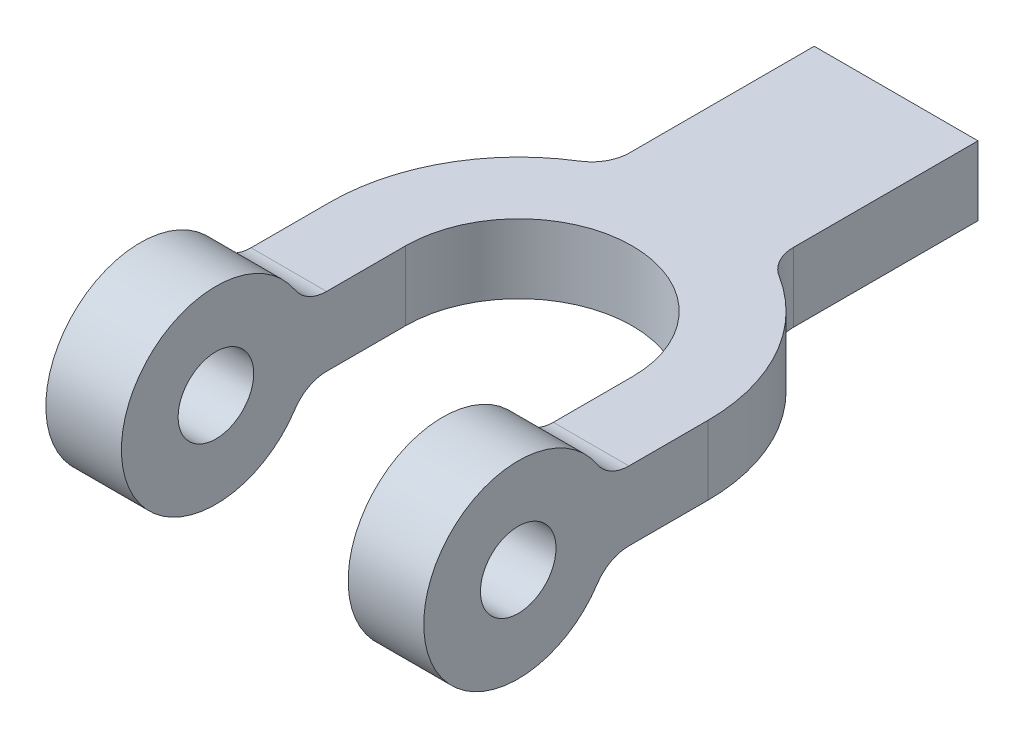
ISO-10303-21;
HEADER;
FILE_DESCRIPTION(('STEP AP214'),'2;1');
FILE_NAME('part.step','',(''),(''),'','','');
FILE_SCHEMA(('AUTOMOTIVE_DESIGN { 1 0 10303 214 1 1 1 1 }'));
ENDSEC;
DATA;
#1=APPLICATION_CONTEXT('core data for automotive mechanical design processes');
#2=APPLICATION_PROTOCOL_DEFINITION('international standard','automotive_design',2000,#1);
#3=PRODUCT_CONTEXT('',#1,'mechanical');
#4=PRODUCT('Part','Part','',(#3));
#5=PRODUCT_RELATED_PRODUCT_CATEGORY('part','',(#4));
#6=PRODUCT_DEFINITION_FORMATION('','',#4);
#7=PRODUCT_DEFINITION_CONTEXT('part definition',#1,'design');
#8=PRODUCT_DEFINITION('design','',#6,#7);
#9=PRODUCT_DEFINITION_SHAPE('','',#8);
#10=(LENGTH_UNIT() NAMED_UNIT(*) SI_UNIT(.MILLI.,.METRE.));
#11=(NAMED_UNIT(*) PLANE_ANGLE_UNIT() SI_UNIT($,.RADIAN.));
#12=(NAMED_UNIT(*) SI_UNIT($,.STERADIAN.) SOLID_ANGLE_UNIT());
#13=UNCERTAINTY_MEASURE_WITH_UNIT(LENGTH_MEASURE(1.E-05),#10,'distance_accuracy_value','');
#14=(GEOMETRIC_REPRESENTATION_CONTEXT(3) GLOBAL_UNCERTAINTY_ASSIGNED_CONTEXT((#13)) GLOBAL_UNIT_ASSIGNED_CONTEXT((#10,
#11,#12)) REPRESENTATION_CONTEXT('',''));
#15=CARTESIAN_POINT('',(0.,0.,0.));
#16=DIRECTION('',(0.,0.,1.));
#17=DIRECTION('',(1.,0.,0.));
#18=AXIS2_PLACEMENT_3D('',#15,#16,#17);
#19=CARTESIAN_POINT('',(-35.,67.5,72.2374584276855));
#20=DIRECTION('',(1.,0.,0.));
#21=DIRECTION('',(0.,0.,-1.));
#22=AXIS2_PLACEMENT_3D('',#19,#20,#21);
#23=PLANE('',#22);
#24=CARTESIAN_POINT('',(-35.,50.,54.7374584276855));
#25=DIRECTION('',(1.,0.,0.));
#26=DIRECTION('',(0.,0.,-1.));
#27=AXIS2_PLACEMENT_3D('',#24,#25,#26);
#28=CIRCLE('',#27,7.);
#29=CARTESIAN_POINT('',(-35.,50.,47.7374584276855));
#30=VERTEX_POINT('',#29);
#31=EDGE_CURVE('E372',#30,#30,#28,.T.);
#32=ORIENTED_EDGE('',*,*,#31,.T.);
#33=EDGE_LOOP('',(#32));
#34=FACE_BOUND('',#33,.T.);
#35=DIRECTION('',(0.,0.,-1.));
#36=VECTOR('',#35,1.);
#37=CARTESIAN_POINT('',(-35.,43.5881606588632,10.9874584276855));
#38=LINE('',#37,#36);
#39=CARTESIAN_POINT('',(-35.,43.5881606588632,34.2344692434827));
#40=VERTEX_POINT('',#39);
#41=CARTESIAN_POINT('',(-35.,43.5881606588632,19.6129708342571));
#42=VERTEX_POINT('',#41);
#43=EDGE_CURVE('E277',#40,#42,#38,.T.);
#44=ORIENTED_EDGE('',*,*,#43,.F.);
#45=CARTESIAN_POINT('',(-35.,36.5881606588632,34.2344692434827));
#46=DIRECTION('',(1.,0.,0.));
#47=DIRECTION('',(0.,0.,-1.));
#48=AXIS2_PLACEMENT_3D('',#45,#46,#47);
#49=CIRCLE('',#48,7.);
#50=CARTESIAN_POINT('',(-35.,40.4201147563309,40.0924661532549));
#51=VERTEX_POINT('',#50);
#52=EDGE_CURVE('E287',#40,#51,#49,.T.);
#53=ORIENTED_EDGE('',*,*,#52,.T.);
#54=CARTESIAN_POINT('',(-35.,50.,54.7374584276855));
#55=DIRECTION('',(1.,0.,0.));
#56=DIRECTION('',(0.,0.,-1.));
#57=AXIS2_PLACEMENT_3D('',#54,#55,#56);
#58=CIRCLE('',#57,17.5);
#59=CARTESIAN_POINT('',(-35.,59.5798852436691,40.0924661532549));
#60=VERTEX_POINT('',#59);
#61=EDGE_CURVE('E382',#60,#51,#58,.T.);
#62=ORIENTED_EDGE('',*,*,#61,.F.);
#63=CARTESIAN_POINT('',(-35.,63.4118393411367,34.2344692434827));
#64=DIRECTION('',(1.,0.,0.));
#65=DIRECTION('',(0.,0.,-1.));
#66=AXIS2_PLACEMENT_3D('',#63,#64,#65);
#67=CIRCLE('',#66,7.);
#68=CARTESIAN_POINT('',(-35.,56.4118393411367,34.2344692434827));
#69=VERTEX_POINT('',#68);
#70=EDGE_CURVE('E310',#69,#60,#67,.F.);
#71=ORIENTED_EDGE('',*,*,#70,.F.);
#72=DIRECTION('',(0.,0.,-1.));
#73=VECTOR('',#72,1.);
#74=CARTESIAN_POINT('',(-35.,56.4118393411367,10.9874584276855));
#75=LINE('',#74,#73);
#76=CARTESIAN_POINT('',(-35.,56.4118393411367,19.6129708342571));
#77=VERTEX_POINT('',#76);
#78=EDGE_CURVE('E313',#69,#77,#75,.T.);
#79=ORIENTED_EDGE('',*,*,#78,.T.);
#80=DIRECTION('',(0.,1.,0.));
#81=VECTOR('',#80,1.);
#82=CARTESIAN_POINT('',(-35.,32.5,19.6129708342571));
#83=LINE('',#82,#81);
#84=EDGE_CURVE('E296',#42,#77,#83,.T.);
#85=ORIENTED_EDGE('',*,*,#84,.F.);
#86=EDGE_LOOP('',(#44,#53,#62,#71,#79,#85));
#87=FACE_BOUND('',#86,.T.);
#88=ADVANCED_FACE('F149',(#34,#87),#23,.F.);
#89=CARTESIAN_POINT('',(35.,67.5,72.2374584276855));
#90=DIRECTION('',(-1.,0.,0.));
#91=DIRECTION('',(0.,0.,1.));
#92=AXIS2_PLACEMENT_3D('',#89,#90,#91);
#93=PLANE('',#92);
#94=CARTESIAN_POINT('',(35.,50.,54.7374584276855));
#95=DIRECTION('',(1.,0.,0.));
#96=DIRECTION('',(0.,0.,-1.));
#97=AXIS2_PLACEMENT_3D('',#94,#95,#96);
#98=CIRCLE('',#97,7.);
#99=CARTESIAN_POINT('',(35.,50.,47.7374584276855));
#100=VERTEX_POINT('',#99);
#101=EDGE_CURVE('E371',#100,#100,#98,.T.);
#102=ORIENTED_EDGE('',*,*,#101,.F.);
#103=EDGE_LOOP('',(#102));
#104=FACE_BOUND('',#103,.T.);
#105=DIRECTION('',(0.,0.,-1.));
#106=VECTOR('',#105,1.);
#107=CARTESIAN_POINT('',(35.,43.5881606588632,10.9874584276855));
#108=LINE('',#107,#106);
#109=CARTESIAN_POINT('',(35.,43.5881606588632,34.2344692434827));
#110=VERTEX_POINT('',#109);
#111=CARTESIAN_POINT('',(35.,43.5881606588632,19.6129708342571));
#112=VERTEX_POINT('',#111);
#113=EDGE_CURVE('E300',#110,#112,#108,.T.);
#114=ORIENTED_EDGE('',*,*,#113,.T.);
#115=DIRECTION('',(0.,1.,0.));
#116=VECTOR('',#115,1.);
#117=CARTESIAN_POINT('',(35.,32.5,19.6129708342571));
#118=LINE('',#117,#116);
#119=CARTESIAN_POINT('',(35.,56.4118393411367,19.6129708342571));
#120=VERTEX_POINT('',#119);
#121=EDGE_CURVE('E390',#112,#120,#118,.T.);
#122=ORIENTED_EDGE('',*,*,#121,.T.);
#123=DIRECTION('',(0.,0.,-1.));
#124=VECTOR('',#123,1.);
#125=CARTESIAN_POINT('',(35.,56.4118393411367,10.9874584276855));
#126=LINE('',#125,#124);
#127=CARTESIAN_POINT('',(35.,56.4118393411367,34.2344692434827));
#128=VERTEX_POINT('',#127);
#129=EDGE_CURVE('E314',#128,#120,#126,.T.);
#130=ORIENTED_EDGE('',*,*,#129,.F.);
#131=CARTESIAN_POINT('',(35.,63.4118393411367,34.2344692434827));
#132=DIRECTION('',(1.,0.,0.));
#133=DIRECTION('',(0.,0.,-1.));
#134=AXIS2_PLACEMENT_3D('',#131,#132,#133);
#135=CIRCLE('',#134,7.);
#136=CARTESIAN_POINT('',(35.,59.5798852436691,40.0924661532549));
#137=VERTEX_POINT('',#136);
#138=EDGE_CURVE('E317',#128,#137,#135,.F.);
#139=ORIENTED_EDGE('',*,*,#138,.T.);
#140=CARTESIAN_POINT('',(35.,50.,54.7374584276855));
#141=DIRECTION('',(1.,0.,0.));
#142=DIRECTION('',(0.,0.,-1.));
#143=AXIS2_PLACEMENT_3D('',#140,#141,#142);
#144=CIRCLE('',#143,17.5);
#145=CARTESIAN_POINT('',(35.,40.4201147563309,40.0924661532549));
#146=VERTEX_POINT('',#145);
#147=EDGE_CURVE('E381',#137,#146,#144,.T.);
#148=ORIENTED_EDGE('',*,*,#147,.T.);
#149=CARTESIAN_POINT('',(35.,36.5881606588632,34.2344692434827));
#150=DIRECTION('',(1.,0.,0.));
#151=DIRECTION('',(0.,0.,-1.));
#152=AXIS2_PLACEMENT_3D('',#149,#150,#151);
#153=CIRCLE('',#152,7.);
#154=EDGE_CURVE('E297',#110,#146,#153,.T.);
#155=ORIENTED_EDGE('',*,*,#154,.F.);
#156=EDGE_LOOP('',(#114,#122,#130,#139,#148,#155));
#157=FACE_BOUND('',#156,.T.);
#158=ADVANCED_FACE('F436',(#104,#157),#93,.F.);
#159=CARTESIAN_POINT('',(-21.,32.5,10.9874584276855));
#160=DIRECTION('',(-1.,0.,0.));
#161=DIRECTION('',(0.,0.,1.));
#162=AXIS2_PLACEMENT_3D('',#159,#160,#161);
#163=PLANE('',#162);
#164=CARTESIAN_POINT('',(-21.,50.,54.7374584276855));
#165=DIRECTION('',(-1.,0.,0.));
#166=DIRECTION('',(0.,0.,1.));
#167=AXIS2_PLACEMENT_3D('',#164,#165,#166);
#168=CIRCLE('',#167,7.);
#169=CARTESIAN_POINT('',(-21.,50.,61.7374584276855));
#170=VERTEX_POINT('',#169);
#171=EDGE_CURVE('E378',#170,#170,#168,.T.);
#172=ORIENTED_EDGE('',*,*,#171,.T.);
#173=EDGE_LOOP('',(#172));
#174=FACE_BOUND('',#173,.T.);
#175=DIRECTION('',(0.,0.,1.));
#176=VECTOR('',#175,1.);
#177=CARTESIAN_POINT('',(-21.,43.5881606588632,10.9874584276855));
#178=LINE('',#177,#176);
#179=CARTESIAN_POINT('',(-21.,43.5881606588632,19.6129708342571));
#180=VERTEX_POINT('',#179);
#181=CARTESIAN_POINT('',(-21.,43.5881606588632,34.2344692434827));
#182=VERTEX_POINT('',#181);
#183=EDGE_CURVE('E280',#180,#182,#178,.T.);
#184=ORIENTED_EDGE('',*,*,#183,.F.);
#185=DIRECTION('',(0.,1.,0.));
#186=VECTOR('',#185,1.);
#187=CARTESIAN_POINT('',(-21.,32.5,19.6129708342571));
#188=LINE('',#187,#186);
#189=CARTESIAN_POINT('',(-21.,56.4118393411367,19.6129708342571));
#190=VERTEX_POINT('',#189);
#191=EDGE_CURVE('E387',#180,#190,#188,.T.);
#192=ORIENTED_EDGE('',*,*,#191,.T.);
#193=DIRECTION('',(0.,0.,1.));
#194=VECTOR('',#193,1.);
#195=CARTESIAN_POINT('',(-21.,56.4118393411367,10.9874584276855));
#196=LINE('',#195,#194);
#197=CARTESIAN_POINT('',(-21.,56.4118393411367,34.2344692434827));
#198=VERTEX_POINT('',#197);
#199=EDGE_CURVE('E339',#190,#198,#196,.T.);
#200=ORIENTED_EDGE('',*,*,#199,.T.);
#201=CARTESIAN_POINT('',(-21.,63.4118393411367,34.2344692434827));
#202=DIRECTION('',(-1.,0.,0.));
#203=DIRECTION('',(0.,0.,1.));
#204=AXIS2_PLACEMENT_3D('',#201,#202,#203);
#205=CIRCLE('',#204,7.);
#206=CARTESIAN_POINT('',(-21.,59.5798852436691,40.0924661532549));
#207=VERTEX_POINT('',#206);
#208=EDGE_CURVE('E367',#207,#198,#205,.F.);
#209=ORIENTED_EDGE('',*,*,#208,.F.);
#210=CARTESIAN_POINT('',(-21.,50.,54.7374584276855));
#211=DIRECTION('',(-1.,0.,0.));
#212=DIRECTION('',(0.,0.,1.));
#213=AXIS2_PLACEMENT_3D('',#210,#211,#212);
#214=CIRCLE('',#213,17.5);
#215=CARTESIAN_POINT('',(-21.,40.4201147563309,40.0924661532549));
#216=VERTEX_POINT('',#215);
#217=EDGE_CURVE('E171',#216,#207,#214,.T.);
#218=ORIENTED_EDGE('',*,*,#217,.F.);
#219=CARTESIAN_POINT('',(-21.,36.5881606588632,34.2344692434827));
#220=DIRECTION('',(-1.,0.,0.));
#221=DIRECTION('',(0.,0.,1.));
#222=AXIS2_PLACEMENT_3D('',#219,#220,#221);
#223=CIRCLE('',#222,7.);
#224=EDGE_CURVE('E369',#216,#182,#223,.T.);
#225=ORIENTED_EDGE('',*,*,#224,.T.);
#226=EDGE_LOOP('',(#184,#192,#200,#209,#218,#225));
#227=FACE_BOUND('',#226,.T.);
#228=ADVANCED_FACE('F476',(#174,#227),#163,.F.);
#229=CARTESIAN_POINT('',(21.,32.5,10.9874584276855));
#230=DIRECTION('',(-1.,0.,0.));
#231=DIRECTION('',(0.,0.,1.));
#232=AXIS2_PLACEMENT_3D('',#229,#230,#231);
#233=PLANE('',#232);
#234=CARTESIAN_POINT('',(21.,50.,54.7374584276855));
#235=DIRECTION('',(-1.,0.,0.));
#236=DIRECTION('',(0.,0.,1.));
#237=AXIS2_PLACEMENT_3D('',#234,#235,#236);
#238=CIRCLE('',#237,7.);
#239=CARTESIAN_POINT('',(21.,50.,61.7374584276855));
#240=VERTEX_POINT('',#239);
#241=EDGE_CURVE('E375',#240,#240,#238,.T.);
#242=ORIENTED_EDGE('',*,*,#241,.F.);
#243=EDGE_LOOP('',(#242));
#244=FACE_BOUND('',#243,.T.);
#245=DIRECTION('',(0.,1.,0.));
#246=VECTOR('',#245,1.);
#247=CARTESIAN_POINT('',(21.,32.5,19.6129708342571));
#248=LINE('',#247,#246);
#249=CARTESIAN_POINT('',(21.,43.5881606588632,19.6129708342571));
#250=VERTEX_POINT('',#249);
#251=CARTESIAN_POINT('',(21.,56.4118393411367,19.6129708342571));
#252=VERTEX_POINT('',#251);
#253=EDGE_CURVE('E386',#250,#252,#248,.T.);
#254=ORIENTED_EDGE('',*,*,#253,.F.);
#255=DIRECTION('',(0.,0.,1.));
#256=VECTOR('',#255,1.);
#257=CARTESIAN_POINT('',(21.,43.5881606588632,10.9874584276855));
#258=LINE('',#257,#256);
#259=CARTESIAN_POINT('',(21.,43.5881606588632,34.2344692434827));
#260=VERTEX_POINT('',#259);
#261=EDGE_CURVE('E356',#250,#260,#258,.T.);
#262=ORIENTED_EDGE('',*,*,#261,.T.);
#263=CARTESIAN_POINT('',(21.,36.5881606588632,34.2344692434827));
#264=DIRECTION('',(-1.,0.,0.));
#265=DIRECTION('',(0.,0.,1.));
#266=AXIS2_PLACEMENT_3D('',#263,#264,#265);
#267=CIRCLE('',#266,7.);
#268=CARTESIAN_POINT('',(21.,40.4201147563309,40.0924661532549));
#269=VERTEX_POINT('',#268);
#270=EDGE_CURVE('E12',#269,#260,#267,.T.);
#271=ORIENTED_EDGE('',*,*,#270,.F.);
#272=CARTESIAN_POINT('',(21.,50.,54.7374584276855));
#273=DIRECTION('',(-1.,0.,0.));
#274=DIRECTION('',(0.,0.,1.));
#275=AXIS2_PLACEMENT_3D('',#272,#273,#274);
#276=CIRCLE('',#275,17.5);
#277=CARTESIAN_POINT('',(21.,59.5798852436691,40.0924661532549));
#278=VERTEX_POINT('',#277);
#279=EDGE_CURVE('E163',#269,#278,#276,.T.);
#280=ORIENTED_EDGE('',*,*,#279,.T.);
#281=CARTESIAN_POINT('',(21.,63.4118393411367,34.2344692434827));
#282=DIRECTION('',(-1.,0.,0.));
#283=DIRECTION('',(0.,0.,1.));
#284=AXIS2_PLACEMENT_3D('',#281,#282,#283);
#285=CIRCLE('',#284,7.);
#286=CARTESIAN_POINT('',(21.,56.4118393411367,34.2344692434827));
#287=VERTEX_POINT('',#286);
#288=EDGE_CURVE('E156',#278,#287,#285,.F.);
#289=ORIENTED_EDGE('',*,*,#288,.T.);
#290=DIRECTION('',(0.,0.,1.));
#291=VECTOR('',#290,1.);
#292=CARTESIAN_POINT('',(21.,56.4118393411367,10.9874584276855));
#293=LINE('',#292,#291);
#294=EDGE_CURVE('E337',#252,#287,#293,.T.);
#295=ORIENTED_EDGE('',*,*,#294,.F.);
#296=EDGE_LOOP('',(#254,#262,#271,#280,#289,#295));
#297=FACE_BOUND('',#296,.T.);
#298=ADVANCED_FACE('F426',(#244,#297),#233,.T.);
#299=CARTESIAN_POINT('',(35.,67.5,-50.2625415723145));
#300=DIRECTION('',(0.,0.,1.));
#301=DIRECTION('',(1.,0.,0.));
#302=AXIS2_PLACEMENT_3D('',#299,#300,#301);
#303=PLANE('',#302);
#304=DIRECTION('',(1.,0.,0.));
#305=VECTOR('',#304,1.);
#306=CARTESIAN_POINT('',(-35.,43.5881606588632,-50.2625415723145));
#307=LINE('',#306,#305);
#308=CARTESIAN_POINT('',(-15.1716715608048,43.5881606588632,-50.2625415723145));
#309=VERTEX_POINT('',#308);
#310=CARTESIAN_POINT('',(15.1716715608048,43.5881606588632,-50.2625415723145));
#311=VERTEX_POINT('',#310);
#312=EDGE_CURVE('E306',#309,#311,#307,.T.);
#313=ORIENTED_EDGE('',*,*,#312,.F.);
#314=DIRECTION('',(0.,1.,0.));
#315=VECTOR('',#314,1.);
#316=CARTESIAN_POINT('',(-15.1716715608048,32.5,-50.2625415723145));
#317=LINE('',#316,#315);
#318=CARTESIAN_POINT('',(-15.1716715608048,56.4118393411367,-50.2625415723145));
#319=VERTEX_POINT('',#318);
#320=EDGE_CURVE('E406',#309,#319,#317,.T.);
#321=ORIENTED_EDGE('',*,*,#320,.T.);
#322=DIRECTION('',(1.,0.,0.));
#323=VECTOR('',#322,1.);
#324=CARTESIAN_POINT('',(-35.,56.4118393411367,-50.2625415723145));
#325=LINE('',#324,#323);
#326=CARTESIAN_POINT('',(15.1716715608048,56.4118393411367,-50.2625415723145));
#327=VERTEX_POINT('',#326);
#328=EDGE_CURVE('E324',#319,#327,#325,.T.);
#329=ORIENTED_EDGE('',*,*,#328,.T.);
#330=DIRECTION('',(0.,1.,0.));
#331=VECTOR('',#330,1.);
#332=CARTESIAN_POINT('',(15.1716715608048,32.5,-50.2625415723145));
#333=LINE('',#332,#331);
#334=EDGE_CURVE('E400',#311,#327,#333,.T.);
#335=ORIENTED_EDGE('',*,*,#334,.F.);
#336=EDGE_LOOP('',(#313,#321,#329,#335));
#337=FACE_BOUND('',#336,.T.);
#338=ADVANCED_FACE('F455',(#337),#303,.F.);
#339=CARTESIAN_POINT('',(0.,32.5,19.6129708342571));
#340=DIRECTION('',(0.,1.,0.));
#341=DIRECTION('',(0.,0.,1.));
#342=AXIS2_PLACEMENT_3D('',#339,#340,#341);
#343=CYLINDRICAL_SURFACE('',#342,35.);
#344=DIRECTION('',(0.,1.,0.));
#345=VECTOR('',#344,1.);
#346=CARTESIAN_POINT('',(-18.4763929673373,32.5,-10.1128244102191));
#347=LINE('',#346,#345);
#348=CARTESIAN_POINT('',(-18.4763929673373,43.5881606588632,-10.1128244102191));
#349=VERTEX_POINT('',#348);
#350=CARTESIAN_POINT('',(-18.4763929673373,56.4118393411367,-10.1128244102191));
#351=VERTEX_POINT('',#350);
#352=EDGE_CURVE('E396',#349,#351,#347,.T.);
#353=ORIENTED_EDGE('',*,*,#352,.F.);
#354=CARTESIAN_POINT('',(0.,43.5881606588632,19.6129708342571));
#355=DIRECTION('',(0.,-1.,0.));
#356=DIRECTION('',(0.,0.,-1.));
#357=AXIS2_PLACEMENT_3D('',#354,#355,#356);
#358=CIRCLE('',#357,35.);
#359=EDGE_CURVE('E365',#349,#42,#358,.F.);
#360=ORIENTED_EDGE('',*,*,#359,.T.);
#361=ORIENTED_EDGE('',*,*,#84,.T.);
#362=CARTESIAN_POINT('',(0.,56.4118393411367,19.6129708342571));
#363=DIRECTION('',(0.,-1.,0.));
#364=DIRECTION('',(0.,0.,-1.));
#365=AXIS2_PLACEMENT_3D('',#362,#363,#364);
#366=CIRCLE('',#365,35.);
#367=EDGE_CURVE('E347',#351,#77,#366,.F.);
#368=ORIENTED_EDGE('',*,*,#367,.F.);
#369=EDGE_LOOP('',(#353,#360,#361,#368));
#370=FACE_BOUND('',#369,.T.);
#371=ADVANCED_FACE('F468',(#370),#343,.T.);
#372=CARTESIAN_POINT('',(-15.1716715608048,32.5,10.9874584276855));
#373=DIRECTION('',(-1.,0.,0.));
#374=DIRECTION('',(0.,0.,1.));
#375=AXIS2_PLACEMENT_3D('',#372,#373,#374);
#376=PLANE('',#375);
#377=ORIENTED_EDGE('',*,*,#320,.F.);
#378=DIRECTION('',(0.,0.,1.));
#379=VECTOR('',#378,1.);
#380=CARTESIAN_POINT('',(-15.1716715608048,43.5881606588632,10.9874584276855));
#381=LINE('',#380,#379);
#382=CARTESIAN_POINT('',(-15.1716715608048,43.5881606588632,-16.0579834591144));
#383=VERTEX_POINT('',#382);
#384=EDGE_CURVE('E362',#309,#383,#381,.T.);
#385=ORIENTED_EDGE('',*,*,#384,.T.);
#386=DIRECTION('',(0.,1.,0.));
#387=VECTOR('',#386,1.);
#388=CARTESIAN_POINT('',(-15.1716715608048,32.5,-16.0579834591144));
#389=LINE('',#388,#387);
#390=CARTESIAN_POINT('',(-15.1716715608048,56.4118393411367,-16.0579834591144));
#391=VERTEX_POINT('',#390);
#392=EDGE_CURVE('E409',#383,#391,#389,.T.);
#393=ORIENTED_EDGE('',*,*,#392,.T.);
#394=DIRECTION('',(0.,0.,1.));
#395=VECTOR('',#394,1.);
#396=CARTESIAN_POINT('',(-15.1716715608048,56.4118393411367,10.9874584276855));
#397=LINE('',#396,#395);
#398=EDGE_CURVE('E345',#319,#391,#397,.T.);
#399=ORIENTED_EDGE('',*,*,#398,.F.);
#400=EDGE_LOOP('',(#377,#385,#393,#399));
#401=FACE_BOUND('',#400,.T.);
#402=ADVANCED_FACE('F459',(#401),#376,.T.);
#403=CARTESIAN_POINT('',(-22.1716715608048,32.5,-16.0579834591144));
#404=DIRECTION('',(0.,1.,0.));
#405=DIRECTION('',(0.,0.,1.));
#406=AXIS2_PLACEMENT_3D('',#403,#404,#405);
#407=CYLINDRICAL_SURFACE('',#406,7.);
#408=CARTESIAN_POINT('',(-22.1716715608048,43.5881606588632,-16.0579834591144));
#409=DIRECTION('',(0.,-1.,0.));
#410=DIRECTION('',(0.,0.,-1.));
#411=AXIS2_PLACEMENT_3D('',#408,#409,#410);
#412=CIRCLE('',#411,7.);
#413=EDGE_CURVE('E360',#349,#383,#412,.F.);
#414=ORIENTED_EDGE('',*,*,#413,.F.);
#415=ORIENTED_EDGE('',*,*,#352,.T.);
#416=CARTESIAN_POINT('',(-22.1716715608048,56.4118393411367,-16.0579834591144));
#417=DIRECTION('',(0.,-1.,0.));
#418=DIRECTION('',(0.,0.,-1.));
#419=AXIS2_PLACEMENT_3D('',#416,#417,#418);
#420=CIRCLE('',#419,7.);
#421=EDGE_CURVE('E342',#351,#391,#420,.F.);
#422=ORIENTED_EDGE('',*,*,#421,.T.);
#423=ORIENTED_EDGE('',*,*,#392,.F.);
#424=EDGE_LOOP('',(#414,#415,#422,#423));
#425=FACE_BOUND('',#424,.T.);
#426=ADVANCED_FACE('F463',(#425),#407,.F.);
#427=CARTESIAN_POINT('',(0.,32.5,19.6129708342571));
#428=DIRECTION('',(0.,1.,0.));
#429=DIRECTION('',(0.,0.,1.));
#430=AXIS2_PLACEMENT_3D('',#427,#428,#429);
#431=CYLINDRICAL_SURFACE('',#430,21.);
#432=CARTESIAN_POINT('',(0.,43.5881606588632,19.6129708342571));
#433=DIRECTION('',(0.,-1.,0.));
#434=DIRECTION('',(0.,0.,-1.));
#435=AXIS2_PLACEMENT_3D('',#432,#433,#434);
#436=CIRCLE('',#435,21.);
#437=EDGE_CURVE('E354',#250,#180,#436,.F.);
#438=ORIENTED_EDGE('',*,*,#437,.F.);
#439=ORIENTED_EDGE('',*,*,#253,.T.);
#440=CARTESIAN_POINT('',(0.,56.4118393411367,19.6129708342571));
#441=DIRECTION('',(0.,-1.,0.));
#442=DIRECTION('',(0.,0.,-1.));
#443=AXIS2_PLACEMENT_3D('',#440,#441,#442);
#444=CIRCLE('',#443,21.);
#445=EDGE_CURVE('E334',#252,#190,#444,.F.);
#446=ORIENTED_EDGE('',*,*,#445,.T.);
#447=ORIENTED_EDGE('',*,*,#191,.F.);
#448=EDGE_LOOP('',(#438,#439,#446,#447));
#449=FACE_BOUND('',#448,.T.);
#450=ADVANCED_FACE('F474',(#449),#431,.F.);
#451=CARTESIAN_POINT('',(0.,32.5,19.6129708342571));
#452=DIRECTION('',(0.,1.,0.));
#453=DIRECTION('',(0.,0.,1.));
#454=AXIS2_PLACEMENT_3D('',#451,#452,#453);
#455=CYLINDRICAL_SURFACE('',#454,35.);
#456=ORIENTED_EDGE('',*,*,#121,.F.);
#457=CARTESIAN_POINT('',(0.,43.5881606588632,19.6129708342571));
#458=DIRECTION('',(0.,-1.,0.));
#459=DIRECTION('',(0.,0.,-1.));
#460=AXIS2_PLACEMENT_3D('',#457,#458,#459);
#461=CIRCLE('',#460,35.);
#462=CARTESIAN_POINT('',(18.4763929673373,43.5881606588632,-10.1128244102191));
#463=VERTEX_POINT('',#462);
#464=EDGE_CURVE('E351',#112,#463,#461,.F.);
#465=ORIENTED_EDGE('',*,*,#464,.T.);
#466=DIRECTION('',(0.,1.,0.));
#467=VECTOR('',#466,1.);
#468=CARTESIAN_POINT('',(18.4763929673373,32.5,-10.1128244102191));
#469=LINE('',#468,#467);
#470=CARTESIAN_POINT('',(18.4763929673373,56.4118393411367,-10.1128244102191));
#471=VERTEX_POINT('',#470);
#472=EDGE_CURVE('E393',#463,#471,#469,.T.);
#473=ORIENTED_EDGE('',*,*,#472,.T.);
#474=CARTESIAN_POINT('',(0.,56.4118393411367,19.6129708342571));
#475=DIRECTION('',(0.,-1.,0.));
#476=DIRECTION('',(0.,0.,-1.));
#477=AXIS2_PLACEMENT_3D('',#474,#475,#476);
#478=CIRCLE('',#477,35.);
#479=EDGE_CURVE('E332',#120,#471,#478,.F.);
#480=ORIENTED_EDGE('',*,*,#479,.F.);
#481=EDGE_LOOP('',(#456,#465,#473,#480));
#482=FACE_BOUND('',#481,.T.);
#483=ADVANCED_FACE('F443',(#482),#455,.T.);
#484=CARTESIAN_POINT('',(22.1716715608048,32.5,-16.0579834591144));
#485=DIRECTION('',(0.,1.,0.));
#486=DIRECTION('',(0.,0.,1.));
#487=AXIS2_PLACEMENT_3D('',#484,#485,#486);
#488=CYLINDRICAL_SURFACE('',#487,7.);
#489=CARTESIAN_POINT('',(22.1716715608048,43.5881606588632,-16.0579834591144));
#490=DIRECTION('',(0.,-1.,0.));
#491=DIRECTION('',(0.,0.,-1.));
#492=AXIS2_PLACEMENT_3D('',#489,#490,#491);
#493=CIRCLE('',#492,7.);
#494=CARTESIAN_POINT('',(15.1716715608048,43.5881606588632,-16.0579834591144));
#495=VERTEX_POINT('',#494);
#496=EDGE_CURVE('E349',#495,#463,#493,.F.);
#497=ORIENTED_EDGE('',*,*,#496,.F.);
#498=DIRECTION('',(0.,1.,0.));
#499=VECTOR('',#498,1.);
#500=CARTESIAN_POINT('',(15.1716715608048,32.5,-16.0579834591144));
#501=LINE('',#500,#499);
#502=CARTESIAN_POINT('',(15.1716715608048,56.4118393411367,-16.0579834591144));
#503=VERTEX_POINT('',#502);
#504=EDGE_CURVE('E397',#495,#503,#501,.T.);
#505=ORIENTED_EDGE('',*,*,#504,.T.);
#506=CARTESIAN_POINT('',(22.1716715608048,56.4118393411367,-16.0579834591144));
#507=DIRECTION('',(0.,-1.,0.));
#508=DIRECTION('',(0.,0.,-1.));
#509=AXIS2_PLACEMENT_3D('',#506,#507,#508);
#510=CIRCLE('',#509,7.);
#511=EDGE_CURVE('E308',#503,#471,#510,.F.);
#512=ORIENTED_EDGE('',*,*,#511,.T.);
#513=ORIENTED_EDGE('',*,*,#472,.F.);
#514=EDGE_LOOP('',(#497,#505,#512,#513));
#515=FACE_BOUND('',#514,.T.);
#516=ADVANCED_FACE('F447',(#515),#488,.F.);
#517=CARTESIAN_POINT('',(15.1716715608048,32.5,10.9874584276855));
#518=DIRECTION('',(-1.,0.,0.));
#519=DIRECTION('',(0.,0.,1.));
#520=AXIS2_PLACEMENT_3D('',#517,#518,#519);
#521=PLANE('',#520);
#522=DIRECTION('',(0.,0.,1.));
#523=VECTOR('',#522,1.);
#524=CARTESIAN_POINT('',(15.1716715608048,43.5881606588632,10.9874584276855));
#525=LINE('',#524,#523);
#526=EDGE_CURVE('E420',#311,#495,#525,.T.);
#527=ORIENTED_EDGE('',*,*,#526,.F.);
#528=ORIENTED_EDGE('',*,*,#334,.T.);
#529=DIRECTION('',(0.,0.,1.));
#530=VECTOR('',#529,1.);
#531=CARTESIAN_POINT('',(15.1716715608048,56.4118393411367,10.9874584276855));
#532=LINE('',#531,#530);
#533=EDGE_CURVE('E415',#327,#503,#532,.T.);
#534=ORIENTED_EDGE('',*,*,#533,.T.);
#535=ORIENTED_EDGE('',*,*,#504,.F.);
#536=EDGE_LOOP('',(#527,#528,#534,#535));
#537=FACE_BOUND('',#536,.T.);
#538=ADVANCED_FACE('F451',(#537),#521,.F.);
#539=CARTESIAN_POINT('',(-35.,50.,54.7374584276855));
#540=DIRECTION('',(1.,0.,0.));
#541=DIRECTION('',(0.,0.,-1.));
#542=AXIS2_PLACEMENT_3D('',#539,#540,#541);
#543=CYLINDRICAL_SURFACE('',#542,17.5);
#544=ORIENTED_EDGE('',*,*,#279,.F.);
#545=DIRECTION('',(1.,0.,0.));
#546=VECTOR('',#545,1.);
#547=CARTESIAN_POINT('',(-35.,40.4201147563309,40.0924661532549));
#548=LINE('',#547,#546);
#549=EDGE_CURVE('E282',#269,#146,#548,.T.);
#550=ORIENTED_EDGE('',*,*,#549,.T.);
#551=ORIENTED_EDGE('',*,*,#147,.F.);
#552=DIRECTION('',(1.,0.,0.));
#553=VECTOR('',#552,1.);
#554=CARTESIAN_POINT('',(-35.,59.5798852436691,40.0924661532549));
#555=LINE('',#554,#553);
#556=EDGE_CURVE('E323',#278,#137,#555,.T.);
#557=ORIENTED_EDGE('',*,*,#556,.F.);
#558=EDGE_LOOP('',(#544,#550,#551,#557));
#559=FACE_BOUND('',#558,.T.);
#560=ADVANCED_FACE('F433',(#559),#543,.T.);
#561=ORIENTED_EDGE('',*,*,#217,.T.);
#562=EDGE_CURVE('E304',#60,#207,#555,.T.);
#563=ORIENTED_EDGE('',*,*,#562,.F.);
#564=ORIENTED_EDGE('',*,*,#61,.T.);
#565=EDGE_CURVE('E290',#51,#216,#548,.T.);
#566=ORIENTED_EDGE('',*,*,#565,.T.);
#567=EDGE_LOOP('',(#561,#563,#564,#566));
#568=FACE_BOUND('',#567,.T.);
#569=ADVANCED_FACE('F478',(#568),#543,.T.);
#570=CARTESIAN_POINT('',(-35.,50.,54.7374584276855));
#571=DIRECTION('',(1.,0.,0.));
#572=DIRECTION('',(0.,0.,-1.));
#573=AXIS2_PLACEMENT_3D('',#570,#571,#572);
#574=CYLINDRICAL_SURFACE('',#573,7.);
#575=ORIENTED_EDGE('',*,*,#241,.T.);
#576=EDGE_LOOP('',(#575));
#577=FACE_BOUND('',#576,.T.);
#578=ORIENTED_EDGE('',*,*,#101,.T.);
#579=EDGE_LOOP('',(#578));
#580=FACE_BOUND('',#579,.T.);
#581=ADVANCED_FACE('F491',(#577,#580),#574,.F.);
#582=ORIENTED_EDGE('',*,*,#31,.F.);
#583=EDGE_LOOP('',(#582));
#584=FACE_BOUND('',#583,.T.);
#585=ORIENTED_EDGE('',*,*,#171,.F.);
#586=EDGE_LOOP('',(#585));
#587=FACE_BOUND('',#586,.T.);
#588=ADVANCED_FACE('F484',(#584,#587),#574,.F.);
#589=CARTESIAN_POINT('',(-35.,63.4118393411367,34.2344692434827));
#590=DIRECTION('',(1.,0.,0.));
#591=DIRECTION('',(0.,0.,-1.));
#592=AXIS2_PLACEMENT_3D('',#589,#590,#591);
#593=CYLINDRICAL_SURFACE('',#592,7.);
#594=ORIENTED_EDGE('',*,*,#208,.T.);
#595=DIRECTION('',(1.,0.,0.));
#596=VECTOR('',#595,1.);
#597=CARTESIAN_POINT('',(-35.,56.4118393411367,34.2344692434827));
#598=LINE('',#597,#596);
#599=EDGE_CURVE('E327',#69,#198,#598,.T.);
#600=ORIENTED_EDGE('',*,*,#599,.F.);
#601=ORIENTED_EDGE('',*,*,#70,.T.);
#602=ORIENTED_EDGE('',*,*,#562,.T.);
#603=EDGE_LOOP('',(#594,#600,#601,#602));
#604=FACE_BOUND('',#603,.T.);
#605=ADVANCED_FACE('F482',(#604),#593,.F.);
#606=CARTESIAN_POINT('',(-35.,56.4118393411367,10.9874584276855));
#607=DIRECTION('',(0.,-1.,0.));
#608=DIRECTION('',(0.,0.,-1.));
#609=AXIS2_PLACEMENT_3D('',#606,#607,#608);
#610=PLANE('',#609);
#611=ORIENTED_EDGE('',*,*,#367,.T.);
#612=ORIENTED_EDGE('',*,*,#78,.F.);
#613=ORIENTED_EDGE('',*,*,#599,.T.);
#614=ORIENTED_EDGE('',*,*,#199,.F.);
#615=ORIENTED_EDGE('',*,*,#445,.F.);
#616=ORIENTED_EDGE('',*,*,#294,.T.);
#617=EDGE_CURVE('E316',#287,#128,#598,.T.);
#618=ORIENTED_EDGE('',*,*,#617,.T.);
#619=ORIENTED_EDGE('',*,*,#129,.T.);
#620=ORIENTED_EDGE('',*,*,#479,.T.);
#621=ORIENTED_EDGE('',*,*,#511,.F.);
#622=ORIENTED_EDGE('',*,*,#533,.F.);
#623=ORIENTED_EDGE('',*,*,#328,.F.);
#624=ORIENTED_EDGE('',*,*,#398,.T.);
#625=ORIENTED_EDGE('',*,*,#421,.F.);
#626=EDGE_LOOP('',(#611,#612,#613,#614,#615,#616,#618,#619,#620,#621,#622,#623,#624,#625));
#627=FACE_BOUND('',#626,.T.);
#628=ADVANCED_FACE('F441',(#627),#610,.F.);
#629=ORIENTED_EDGE('',*,*,#556,.T.);
#630=ORIENTED_EDGE('',*,*,#138,.F.);
#631=ORIENTED_EDGE('',*,*,#617,.F.);
#632=ORIENTED_EDGE('',*,*,#288,.F.);
#633=EDGE_LOOP('',(#629,#630,#631,#632));
#634=FACE_BOUND('',#633,.T.);
#635=ADVANCED_FACE('F431',(#634),#593,.F.);
#636=CARTESIAN_POINT('',(-35.,36.5881606588632,34.2344692434827));
#637=DIRECTION('',(1.,0.,0.));
#638=DIRECTION('',(0.,0.,-1.));
#639=AXIS2_PLACEMENT_3D('',#636,#637,#638);
#640=CYLINDRICAL_SURFACE('',#639,7.);
#641=ORIENTED_EDGE('',*,*,#565,.F.);
#642=ORIENTED_EDGE('',*,*,#52,.F.);
#643=DIRECTION('',(1.,0.,0.));
#644=VECTOR('',#643,1.);
#645=CARTESIAN_POINT('',(-35.,43.5881606588632,34.2344692434827));
#646=LINE('',#645,#644);
#647=EDGE_CURVE('E273',#40,#182,#646,.T.);
#648=ORIENTED_EDGE('',*,*,#647,.T.);
#649=ORIENTED_EDGE('',*,*,#224,.F.);
#650=EDGE_LOOP('',(#641,#642,#648,#649));
#651=FACE_BOUND('',#650,.T.);
#652=ADVANCED_FACE('F288',(#651),#640,.F.);
#653=CARTESIAN_POINT('',(-35.,43.5881606588632,10.9874584276855));
#654=DIRECTION('',(0.,-1.,0.));
#655=DIRECTION('',(0.,0.,-1.));
#656=AXIS2_PLACEMENT_3D('',#653,#654,#655);
#657=PLANE('',#656);
#658=ORIENTED_EDGE('',*,*,#413,.T.);
#659=ORIENTED_EDGE('',*,*,#384,.F.);
#660=ORIENTED_EDGE('',*,*,#312,.T.);
#661=ORIENTED_EDGE('',*,*,#526,.T.);
#662=ORIENTED_EDGE('',*,*,#496,.T.);
#663=ORIENTED_EDGE('',*,*,#464,.F.);
#664=ORIENTED_EDGE('',*,*,#113,.F.);
#665=EDGE_CURVE('E283',#260,#110,#646,.T.);
#666=ORIENTED_EDGE('',*,*,#665,.F.);
#667=ORIENTED_EDGE('',*,*,#261,.F.);
#668=ORIENTED_EDGE('',*,*,#437,.T.);
#669=ORIENTED_EDGE('',*,*,#183,.T.);
#670=ORIENTED_EDGE('',*,*,#647,.F.);
#671=ORIENTED_EDGE('',*,*,#43,.T.);
#672=ORIENTED_EDGE('',*,*,#359,.F.);
#673=EDGE_LOOP('',(#658,#659,#660,#661,#662,#663,#664,#666,#667,#668,#669,#670,#671,#672));
#674=FACE_BOUND('',#673,.T.);
#675=ADVANCED_FACE('F275',(#674),#657,.T.);
#676=ORIENTED_EDGE('',*,*,#270,.T.);
#677=ORIENTED_EDGE('',*,*,#665,.T.);
#678=ORIENTED_EDGE('',*,*,#154,.T.);
#679=ORIENTED_EDGE('',*,*,#549,.F.);
#680=EDGE_LOOP('',(#676,#677,#678,#679));
#681=FACE_BOUND('',#680,.T.);
#682=ADVANCED_FACE('F607',(#681),#640,.F.);
#683=CLOSED_SHELL('',(#88,#158,#228,#298,#338,#371,#402,#426,#450,#483,#516,#538,#560,#569,#581,
#588,#605,#628,#635,#652,#675,#682));
#684=MANIFOLD_SOLID_BREP('B2',#683);
#685=ADVANCED_BREP_SHAPE_REPRESENTATION('',(#18,#684),#14);
#686=SHAPE_DEFINITION_REPRESENTATION(#9,#685);
ENDSEC;
END-ISO-10303-21;
